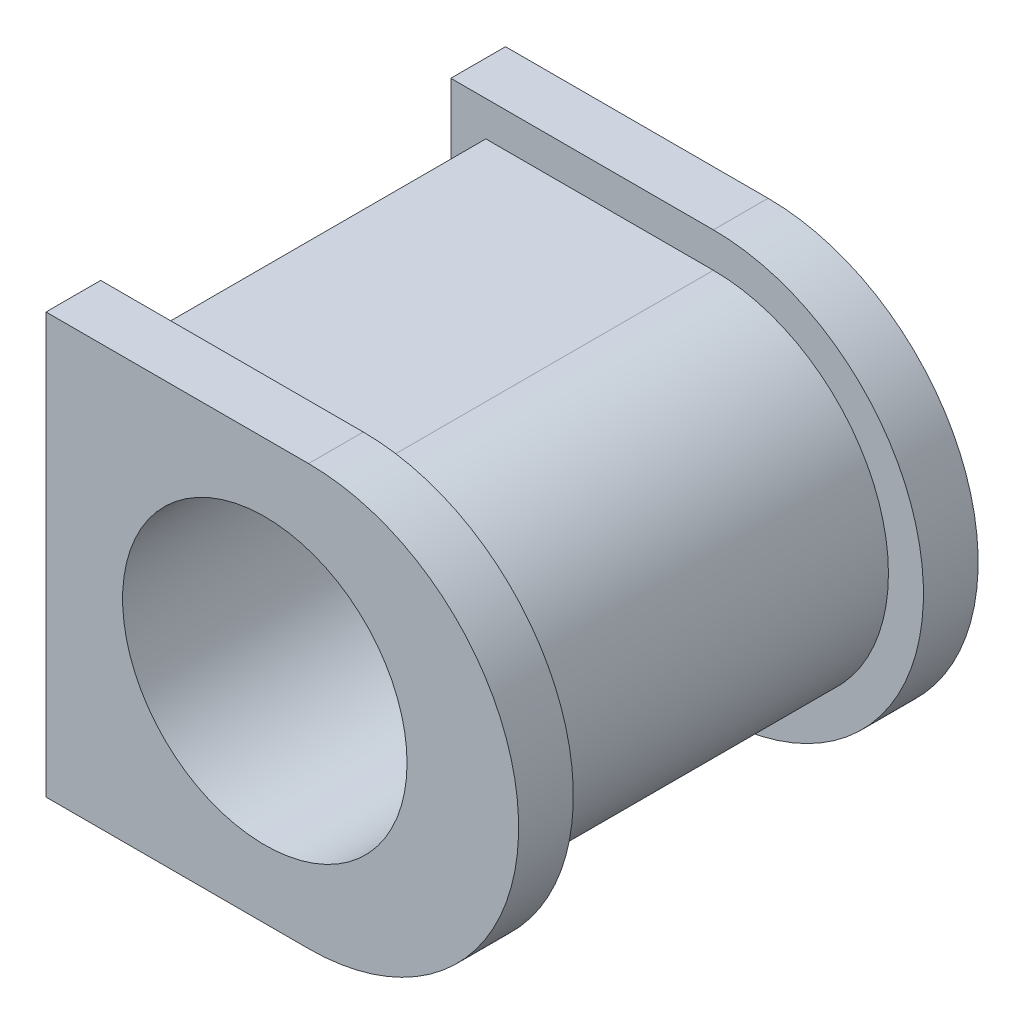
ISO-10303-21;
HEADER;
FILE_DESCRIPTION(('STEP AP214'),'2;1');
FILE_NAME('part.step','',(''),(''),'','','');
FILE_SCHEMA(('AUTOMOTIVE_DESIGN { 1 0 10303 214 1 1 1 1 }'));
ENDSEC;
DATA;
#1=APPLICATION_CONTEXT('core data for automotive mechanical design processes');
#2=APPLICATION_PROTOCOL_DEFINITION('international standard','automotive_design',2000,#1);
#3=PRODUCT_CONTEXT('',#1,'mechanical');
#4=PRODUCT('Part','Part','',(#3));
#5=PRODUCT_RELATED_PRODUCT_CATEGORY('part','',(#4));
#6=PRODUCT_DEFINITION_FORMATION('','',#4);
#7=PRODUCT_DEFINITION_CONTEXT('part definition',#1,'design');
#8=PRODUCT_DEFINITION('design','',#6,#7);
#9=PRODUCT_DEFINITION_SHAPE('','',#8);
#10=(LENGTH_UNIT() NAMED_UNIT(*) SI_UNIT(.MILLI.,.METRE.));
#11=(NAMED_UNIT(*) PLANE_ANGLE_UNIT() SI_UNIT($,.RADIAN.));
#12=(NAMED_UNIT(*) SI_UNIT($,.STERADIAN.) SOLID_ANGLE_UNIT());
#13=UNCERTAINTY_MEASURE_WITH_UNIT(LENGTH_MEASURE(1.E-05),#10,'distance_accuracy_value','');
#14=(GEOMETRIC_REPRESENTATION_CONTEXT(3) GLOBAL_UNCERTAINTY_ASSIGNED_CONTEXT((#13)) GLOBAL_UNIT_ASSIGNED_CONTEXT((#10,
#11,#12)) REPRESENTATION_CONTEXT('',''));
#15=CARTESIAN_POINT('',(0.,0.,0.));
#16=DIRECTION('',(0.,0.,1.));
#17=DIRECTION('',(1.,0.,0.));
#18=AXIS2_PLACEMENT_3D('',#15,#16,#17);
#19=CARTESIAN_POINT('',(0.,40.,80.));
#20=DIRECTION('',(0.,-1.,0.));
#21=DIRECTION('',(0.,0.,-1.));
#22=AXIS2_PLACEMENT_3D('',#19,#20,#21);
#23=PLANE('',#22);
#24=DIRECTION('',(-1.,0.,0.));
#25=VECTOR('',#24,1.);
#26=CARTESIAN_POINT('',(0.,40.,0.));
#27=LINE('',#26,#25);
#28=CARTESIAN_POINT('',(52.,40.,0.));
#29=VERTEX_POINT('',#28);
#30=CARTESIAN_POINT('',(0.,40.,0.));
#31=VERTEX_POINT('',#30);
#32=EDGE_CURVE('E142',#29,#31,#27,.T.);
#33=ORIENTED_EDGE('',*,*,#32,.T.);
#34=DIRECTION('',(0.,0.,-1.));
#35=VECTOR('',#34,1.);
#36=CARTESIAN_POINT('',(0.,40.,80.));
#37=LINE('',#36,#35);
#38=CARTESIAN_POINT('',(0.,40.,80.));
#39=VERTEX_POINT('',#38);
#40=EDGE_CURVE('E11',#39,#31,#37,.T.);
#41=ORIENTED_EDGE('',*,*,#40,.F.);
#42=DIRECTION('',(-1.,0.,0.));
#43=VECTOR('',#42,1.);
#44=CARTESIAN_POINT('',(0.,40.,80.));
#45=LINE('',#44,#43);
#46=CARTESIAN_POINT('',(52.,40.,80.));
#47=VERTEX_POINT('',#46);
#48=EDGE_CURVE('E209',#47,#39,#45,.T.);
#49=ORIENTED_EDGE('',*,*,#48,.F.);
#50=DIRECTION('',(0.,0.,-1.));
#51=VECTOR('',#50,1.);
#52=CARTESIAN_POINT('',(52.,40.,80.));
#53=LINE('',#52,#51);
#54=EDGE_CURVE('E221',#47,#29,#53,.T.);
#55=ORIENTED_EDGE('',*,*,#54,.T.);
#56=EDGE_LOOP('',(#33,#41,#49,#55));
#57=FACE_BOUND('',#56,.T.);
#58=ADVANCED_FACE('F37',(#57),#23,.F.);
#59=CARTESIAN_POINT('',(0.,-40.,80.));
#60=DIRECTION('',(1.,0.,0.));
#61=DIRECTION('',(0.,0.,-1.));
#62=AXIS2_PLACEMENT_3D('',#59,#60,#61);
#63=PLANE('',#62);
#64=DIRECTION('',(0.,-1.,0.));
#65=VECTOR('',#64,1.);
#66=CARTESIAN_POINT('',(0.,-40.,0.));
#67=LINE('',#66,#65);
#68=CARTESIAN_POINT('',(0.,-40.,0.));
#69=VERTEX_POINT('',#68);
#70=EDGE_CURVE('E171',#31,#69,#67,.T.);
#71=ORIENTED_EDGE('',*,*,#70,.T.);
#72=DIRECTION('',(0.,0.,-1.));
#73=VECTOR('',#72,1.);
#74=CARTESIAN_POINT('',(0.,-40.,80.));
#75=LINE('',#74,#73);
#76=CARTESIAN_POINT('',(0.,-40.,80.));
#77=VERTEX_POINT('',#76);
#78=EDGE_CURVE('E45',#77,#69,#75,.T.);
#79=ORIENTED_EDGE('',*,*,#78,.F.);
#80=DIRECTION('',(0.,-1.,0.));
#81=VECTOR('',#80,1.);
#82=CARTESIAN_POINT('',(0.,-40.,80.));
#83=LINE('',#82,#81);
#84=EDGE_CURVE('E212',#39,#77,#83,.T.);
#85=ORIENTED_EDGE('',*,*,#84,.F.);
#86=ORIENTED_EDGE('',*,*,#40,.T.);
#87=EDGE_LOOP('',(#71,#79,#85,#86));
#88=FACE_BOUND('',#87,.T.);
#89=ADVANCED_FACE('F227',(#88),#63,.F.);
#90=CARTESIAN_POINT('',(0.,-40.,80.));
#91=DIRECTION('',(0.,1.,0.));
#92=DIRECTION('',(0.,0.,1.));
#93=AXIS2_PLACEMENT_3D('',#90,#91,#92);
#94=PLANE('',#93);
#95=DIRECTION('',(1.,0.,0.));
#96=VECTOR('',#95,1.);
#97=CARTESIAN_POINT('',(0.,-40.,0.));
#98=LINE('',#97,#96);
#99=CARTESIAN_POINT('',(52.,-40.,0.));
#100=VERTEX_POINT('',#99);
#101=EDGE_CURVE('E174',#69,#100,#98,.T.);
#102=ORIENTED_EDGE('',*,*,#101,.T.);
#103=DIRECTION('',(0.,0.,-1.));
#104=VECTOR('',#103,1.);
#105=CARTESIAN_POINT('',(52.,-40.,80.));
#106=LINE('',#105,#104);
#107=CARTESIAN_POINT('',(52.,-40.,80.));
#108=VERTEX_POINT('',#107);
#109=EDGE_CURVE('E52',#108,#100,#106,.T.);
#110=ORIENTED_EDGE('',*,*,#109,.F.);
#111=DIRECTION('',(1.,0.,0.));
#112=VECTOR('',#111,1.);
#113=CARTESIAN_POINT('',(0.,-40.,80.));
#114=LINE('',#113,#112);
#115=EDGE_CURVE('E215',#77,#108,#114,.T.);
#116=ORIENTED_EDGE('',*,*,#115,.F.);
#117=ORIENTED_EDGE('',*,*,#78,.T.);
#118=EDGE_LOOP('',(#102,#110,#116,#117));
#119=FACE_BOUND('',#118,.T.);
#120=ADVANCED_FACE('F225',(#119),#94,.F.);
#121=CARTESIAN_POINT('',(52.,0.,80.));
#122=DIRECTION('',(0.,0.,-1.));
#123=DIRECTION('',(-1.,0.,0.));
#124=AXIS2_PLACEMENT_3D('',#121,#122,#123);
#125=CYLINDRICAL_SURFACE('',#124,40.);
#126=CARTESIAN_POINT('',(52.,0.,0.));
#127=DIRECTION('',(0.,0.,1.));
#128=DIRECTION('',(-1.,0.,0.));
#129=AXIS2_PLACEMENT_3D('',#126,#127,#128);
#130=CIRCLE('',#129,40.);
#131=EDGE_CURVE('E176',#100,#29,#130,.T.);
#132=ORIENTED_EDGE('',*,*,#131,.T.);
#133=ORIENTED_EDGE('',*,*,#54,.F.);
#134=CARTESIAN_POINT('',(52.,0.,80.));
#135=DIRECTION('',(0.,0.,1.));
#136=DIRECTION('',(-1.,0.,0.));
#137=AXIS2_PLACEMENT_3D('',#134,#135,#136);
#138=CIRCLE('',#137,40.);
#139=EDGE_CURVE('E218',#108,#47,#138,.T.);
#140=ORIENTED_EDGE('',*,*,#139,.F.);
#141=ORIENTED_EDGE('',*,*,#109,.T.);
#142=EDGE_LOOP('',(#132,#133,#140,#141));
#143=FACE_BOUND('',#142,.T.);
#144=ADVANCED_FACE('F235',(#143),#125,.T.);
#145=CARTESIAN_POINT('',(-8.,48.,92.5));
#146=DIRECTION('',(0.,-1.,0.));
#147=DIRECTION('',(0.,0.,-1.));
#148=AXIS2_PLACEMENT_3D('',#145,#146,#147);
#149=PLANE('',#148);
#150=DIRECTION('',(-1.,0.,0.));
#151=VECTOR('',#150,1.);
#152=CARTESIAN_POINT('',(-8.,48.,80.));
#153=LINE('',#152,#151);
#154=CARTESIAN_POINT('',(52.,48.,80.));
#155=VERTEX_POINT('',#154);
#156=CARTESIAN_POINT('',(-8.,48.,80.));
#157=VERTEX_POINT('',#156);
#158=EDGE_CURVE('E179',#155,#157,#153,.T.);
#159=ORIENTED_EDGE('',*,*,#158,.T.);
#160=DIRECTION('',(0.,0.,-1.));
#161=VECTOR('',#160,1.);
#162=CARTESIAN_POINT('',(-8.,48.,92.5));
#163=LINE('',#162,#161);
#164=CARTESIAN_POINT('',(-8.,48.,92.5));
#165=VERTEX_POINT('',#164);
#166=EDGE_CURVE('E206',#165,#157,#163,.T.);
#167=ORIENTED_EDGE('',*,*,#166,.F.);
#168=DIRECTION('',(-1.,0.,0.));
#169=VECTOR('',#168,1.);
#170=CARTESIAN_POINT('',(-8.,48.,92.5));
#171=LINE('',#170,#169);
#172=CARTESIAN_POINT('',(52.,48.,92.5));
#173=VERTEX_POINT('',#172);
#174=EDGE_CURVE('E180',#173,#165,#171,.T.);
#175=ORIENTED_EDGE('',*,*,#174,.F.);
#176=DIRECTION('',(0.,0.,-1.));
#177=VECTOR('',#176,1.);
#178=CARTESIAN_POINT('',(52.,48.,92.5));
#179=LINE('',#178,#177);
#180=EDGE_CURVE('E190',#173,#155,#179,.T.);
#181=ORIENTED_EDGE('',*,*,#180,.T.);
#182=EDGE_LOOP('',(#159,#167,#175,#181));
#183=FACE_BOUND('',#182,.T.);
#184=ADVANCED_FACE('F248',(#183),#149,.F.);
#185=CARTESIAN_POINT('',(-8.,48.,92.5));
#186=DIRECTION('',(1.,0.,0.));
#187=DIRECTION('',(0.,1.,0.));
#188=AXIS2_PLACEMENT_3D('',#185,#186,#187);
#189=PLANE('',#188);
#190=DIRECTION('',(0.,-1.,0.));
#191=VECTOR('',#190,1.);
#192=CARTESIAN_POINT('',(-8.,48.,80.));
#193=LINE('',#192,#191);
#194=CARTESIAN_POINT('',(-7.99999999999999,-48.,80.));
#195=VERTEX_POINT('',#194);
#196=EDGE_CURVE('E193',#157,#195,#193,.T.);
#197=ORIENTED_EDGE('',*,*,#196,.T.);
#198=DIRECTION('',(0.,0.,-1.));
#199=VECTOR('',#198,1.);
#200=CARTESIAN_POINT('',(-7.99999999999999,-48.,92.5));
#201=LINE('',#200,#199);
#202=CARTESIAN_POINT('',(-7.99999999999999,-48.,92.5));
#203=VERTEX_POINT('',#202);
#204=EDGE_CURVE('E203',#203,#195,#201,.T.);
#205=ORIENTED_EDGE('',*,*,#204,.F.);
#206=DIRECTION('',(0.,-1.,0.));
#207=VECTOR('',#206,1.);
#208=CARTESIAN_POINT('',(-8.,48.,92.5));
#209=LINE('',#208,#207);
#210=EDGE_CURVE('E183',#165,#203,#209,.T.);
#211=ORIENTED_EDGE('',*,*,#210,.F.);
#212=ORIENTED_EDGE('',*,*,#166,.T.);
#213=EDGE_LOOP('',(#197,#205,#211,#212));
#214=FACE_BOUND('',#213,.T.);
#215=ADVANCED_FACE('F260',(#214),#189,.F.);
#216=CARTESIAN_POINT('',(-7.99999999999999,-48.,92.5));
#217=DIRECTION('',(0.,1.,0.));
#218=DIRECTION('',(0.,0.,1.));
#219=AXIS2_PLACEMENT_3D('',#216,#217,#218);
#220=PLANE('',#219);
#221=DIRECTION('',(1.,0.,0.));
#222=VECTOR('',#221,1.);
#223=CARTESIAN_POINT('',(-7.99999999999999,-48.,80.));
#224=LINE('',#223,#222);
#225=CARTESIAN_POINT('',(52.,-48.,80.));
#226=VERTEX_POINT('',#225);
#227=EDGE_CURVE('E195',#195,#226,#224,.T.);
#228=ORIENTED_EDGE('',*,*,#227,.T.);
#229=DIRECTION('',(0.,0.,-1.));
#230=VECTOR('',#229,1.);
#231=CARTESIAN_POINT('',(52.,-48.,92.5));
#232=LINE('',#231,#230);
#233=CARTESIAN_POINT('',(52.,-48.,92.5));
#234=VERTEX_POINT('',#233);
#235=EDGE_CURVE('E200',#234,#226,#232,.T.);
#236=ORIENTED_EDGE('',*,*,#235,.F.);
#237=DIRECTION('',(1.,0.,0.));
#238=VECTOR('',#237,1.);
#239=CARTESIAN_POINT('',(-7.99999999999999,-48.,92.5));
#240=LINE('',#239,#238);
#241=EDGE_CURVE('E186',#203,#234,#240,.T.);
#242=ORIENTED_EDGE('',*,*,#241,.F.);
#243=ORIENTED_EDGE('',*,*,#204,.T.);
#244=EDGE_LOOP('',(#228,#236,#242,#243));
#245=FACE_BOUND('',#244,.T.);
#246=ADVANCED_FACE('F257',(#245),#220,.F.);
#247=CARTESIAN_POINT('',(52.,0.,92.5));
#248=DIRECTION('',(0.,0.,-1.));
#249=DIRECTION('',(-1.,0.,0.));
#250=AXIS2_PLACEMENT_3D('',#247,#248,#249);
#251=CYLINDRICAL_SURFACE('',#250,48.);
#252=CARTESIAN_POINT('',(52.,0.,80.));
#253=DIRECTION('',(0.,0.,1.));
#254=DIRECTION('',(-1.,0.,0.));
#255=AXIS2_PLACEMENT_3D('',#252,#253,#254);
#256=CIRCLE('',#255,48.);
#257=EDGE_CURVE('E184',#226,#155,#256,.T.);
#258=ORIENTED_EDGE('',*,*,#257,.T.);
#259=ORIENTED_EDGE('',*,*,#180,.F.);
#260=CARTESIAN_POINT('',(52.,0.,92.5));
#261=DIRECTION('',(0.,0.,1.));
#262=DIRECTION('',(-1.,0.,0.));
#263=AXIS2_PLACEMENT_3D('',#260,#261,#262);
#264=CIRCLE('',#263,48.);
#265=EDGE_CURVE('E188',#234,#173,#264,.T.);
#266=ORIENTED_EDGE('',*,*,#265,.F.);
#267=ORIENTED_EDGE('',*,*,#235,.T.);
#268=EDGE_LOOP('',(#258,#259,#266,#267));
#269=FACE_BOUND('',#268,.T.);
#270=ADVANCED_FACE('F253',(#269),#251,.T.);
#271=CARTESIAN_POINT('',(52.,0.,92.5));
#272=DIRECTION('',(0.,0.,-1.));
#273=DIRECTION('',(-1.,0.,0.));
#274=AXIS2_PLACEMENT_3D('',#271,#272,#273);
#275=PLANE('',#274);
#276=CARTESIAN_POINT('',(42.,0.,92.5));
#277=DIRECTION('',(0.,0.,1.));
#278=DIRECTION('',(1.,0.,0.));
#279=AXIS2_PLACEMENT_3D('',#276,#277,#278);
#280=CIRCLE('',#279,32.5);
#281=CARTESIAN_POINT('',(74.5,0.,92.5));
#282=VERTEX_POINT('',#281);
#283=EDGE_CURVE('E439',#282,#282,#280,.T.);
#284=ORIENTED_EDGE('',*,*,#283,.F.);
#285=EDGE_LOOP('',(#284));
#286=FACE_BOUND('',#285,.T.);
#287=ORIENTED_EDGE('',*,*,#174,.T.);
#288=ORIENTED_EDGE('',*,*,#210,.T.);
#289=ORIENTED_EDGE('',*,*,#241,.T.);
#290=ORIENTED_EDGE('',*,*,#265,.T.);
#291=EDGE_LOOP('',(#287,#288,#289,#290));
#292=FACE_BOUND('',#291,.T.);
#293=ADVANCED_FACE('F241',(#286,#292),#275,.F.);
#294=CARTESIAN_POINT('',(52.,0.,80.));
#295=DIRECTION('',(0.,0.,-1.));
#296=DIRECTION('',(-1.,0.,0.));
#297=AXIS2_PLACEMENT_3D('',#294,#295,#296);
#298=PLANE('',#297);
#299=ORIENTED_EDGE('',*,*,#139,.T.);
#300=ORIENTED_EDGE('',*,*,#48,.T.);
#301=ORIENTED_EDGE('',*,*,#84,.T.);
#302=ORIENTED_EDGE('',*,*,#115,.T.);
#303=EDGE_LOOP('',(#299,#300,#301,#302));
#304=FACE_BOUND('',#303,.T.);
#305=ORIENTED_EDGE('',*,*,#158,.F.);
#306=ORIENTED_EDGE('',*,*,#257,.F.);
#307=ORIENTED_EDGE('',*,*,#227,.F.);
#308=ORIENTED_EDGE('',*,*,#196,.F.);
#309=EDGE_LOOP('',(#305,#306,#307,#308));
#310=FACE_BOUND('',#309,.T.);
#311=ADVANCED_FACE('F238',(#304,#310),#298,.T.);
#312=CARTESIAN_POINT('',(-8.,48.,-12.5));
#313=DIRECTION('',(0.,-1.,0.));
#314=DIRECTION('',(0.,0.,1.));
#315=AXIS2_PLACEMENT_3D('',#312,#313,#314);
#316=PLANE('',#315);
#317=DIRECTION('',(-1.,0.,0.));
#318=VECTOR('',#317,1.);
#319=CARTESIAN_POINT('',(-8.,48.,0.));
#320=LINE('',#319,#318);
#321=CARTESIAN_POINT('',(52.,48.,0.));
#322=VERTEX_POINT('',#321);
#323=CARTESIAN_POINT('',(-8.,48.,0.));
#324=VERTEX_POINT('',#323);
#325=EDGE_CURVE('E159',#322,#324,#320,.T.);
#326=ORIENTED_EDGE('',*,*,#325,.F.);
#327=DIRECTION('',(0.,0.,1.));
#328=VECTOR('',#327,1.);
#329=CARTESIAN_POINT('',(52.,48.,-12.5));
#330=LINE('',#329,#328);
#331=CARTESIAN_POINT('',(52.,48.,-12.5));
#332=VERTEX_POINT('',#331);
#333=EDGE_CURVE('E147',#332,#322,#330,.T.);
#334=ORIENTED_EDGE('',*,*,#333,.F.);
#335=DIRECTION('',(-1.,0.,0.));
#336=VECTOR('',#335,1.);
#337=CARTESIAN_POINT('',(-8.,48.,-12.5));
#338=LINE('',#337,#336);
#339=CARTESIAN_POINT('',(-8.,48.,-12.5));
#340=VERTEX_POINT('',#339);
#341=EDGE_CURVE('E126',#332,#340,#338,.T.);
#342=ORIENTED_EDGE('',*,*,#341,.T.);
#343=DIRECTION('',(0.,0.,1.));
#344=VECTOR('',#343,1.);
#345=CARTESIAN_POINT('',(-8.,48.,-12.5));
#346=LINE('',#345,#344);
#347=EDGE_CURVE('E135',#340,#324,#346,.T.);
#348=ORIENTED_EDGE('',*,*,#347,.T.);
#349=EDGE_LOOP('',(#326,#334,#342,#348));
#350=FACE_BOUND('',#349,.T.);
#351=ADVANCED_FACE('F145',(#350),#316,.F.);
#352=CARTESIAN_POINT('',(-8.,48.,-12.5));
#353=DIRECTION('',(1.,0.,0.));
#354=DIRECTION('',(0.,1.,0.));
#355=AXIS2_PLACEMENT_3D('',#352,#353,#354);
#356=PLANE('',#355);
#357=DIRECTION('',(0.,-1.,0.));
#358=VECTOR('',#357,1.);
#359=CARTESIAN_POINT('',(-8.,48.,0.));
#360=LINE('',#359,#358);
#361=CARTESIAN_POINT('',(-7.99999999999999,-48.,0.));
#362=VERTEX_POINT('',#361);
#363=EDGE_CURVE('E138',#324,#362,#360,.T.);
#364=ORIENTED_EDGE('',*,*,#363,.F.);
#365=ORIENTED_EDGE('',*,*,#347,.F.);
#366=DIRECTION('',(0.,-1.,0.));
#367=VECTOR('',#366,1.);
#368=CARTESIAN_POINT('',(-8.,48.,-12.5));
#369=LINE('',#368,#367);
#370=CARTESIAN_POINT('',(-7.99999999999999,-48.,-12.5));
#371=VERTEX_POINT('',#370);
#372=EDGE_CURVE('E122',#340,#371,#369,.T.);
#373=ORIENTED_EDGE('',*,*,#372,.T.);
#374=DIRECTION('',(0.,0.,1.));
#375=VECTOR('',#374,1.);
#376=CARTESIAN_POINT('',(-7.99999999999999,-48.,-12.5));
#377=LINE('',#376,#375);
#378=EDGE_CURVE('E143',#371,#362,#377,.T.);
#379=ORIENTED_EDGE('',*,*,#378,.T.);
#380=EDGE_LOOP('',(#364,#365,#373,#379));
#381=FACE_BOUND('',#380,.T.);
#382=ADVANCED_FACE('F136',(#381),#356,.F.);
#383=CARTESIAN_POINT('',(-7.99999999999999,-48.,-12.5));
#384=DIRECTION('',(0.,1.,0.));
#385=DIRECTION('',(0.,0.,-1.));
#386=AXIS2_PLACEMENT_3D('',#383,#384,#385);
#387=PLANE('',#386);
#388=DIRECTION('',(1.,0.,0.));
#389=VECTOR('',#388,1.);
#390=CARTESIAN_POINT('',(-7.99999999999999,-48.,0.));
#391=LINE('',#390,#389);
#392=CARTESIAN_POINT('',(52.,-48.,0.));
#393=VERTEX_POINT('',#392);
#394=EDGE_CURVE('E150',#362,#393,#391,.T.);
#395=ORIENTED_EDGE('',*,*,#394,.F.);
#396=ORIENTED_EDGE('',*,*,#378,.F.);
#397=DIRECTION('',(1.,0.,0.));
#398=VECTOR('',#397,1.);
#399=CARTESIAN_POINT('',(-7.99999999999999,-48.,-12.5));
#400=LINE('',#399,#398);
#401=CARTESIAN_POINT('',(52.,-48.,-12.5));
#402=VERTEX_POINT('',#401);
#403=EDGE_CURVE('E129',#371,#402,#400,.T.);
#404=ORIENTED_EDGE('',*,*,#403,.T.);
#405=DIRECTION('',(0.,0.,1.));
#406=VECTOR('',#405,1.);
#407=CARTESIAN_POINT('',(52.,-48.,-12.5));
#408=LINE('',#407,#406);
#409=EDGE_CURVE('E165',#402,#393,#408,.T.);
#410=ORIENTED_EDGE('',*,*,#409,.T.);
#411=EDGE_LOOP('',(#395,#396,#404,#410));
#412=FACE_BOUND('',#411,.T.);
#413=ADVANCED_FACE('F359',(#412),#387,.F.);
#414=CARTESIAN_POINT('',(52.,0.,-12.5));
#415=DIRECTION('',(0.,0.,1.));
#416=DIRECTION('',(-1.,0.,0.));
#417=AXIS2_PLACEMENT_3D('',#414,#415,#416);
#418=CYLINDRICAL_SURFACE('',#417,48.);
#419=CARTESIAN_POINT('',(52.,0.,0.));
#420=DIRECTION('',(0.,0.,1.));
#421=DIRECTION('',(-1.,0.,0.));
#422=AXIS2_PLACEMENT_3D('',#419,#420,#421);
#423=CIRCLE('',#422,48.);
#424=EDGE_CURVE('E148',#393,#322,#423,.T.);
#425=ORIENTED_EDGE('',*,*,#424,.F.);
#426=ORIENTED_EDGE('',*,*,#409,.F.);
#427=CARTESIAN_POINT('',(52.,0.,-12.5));
#428=DIRECTION('',(0.,0.,1.));
#429=DIRECTION('',(-1.,0.,0.));
#430=AXIS2_PLACEMENT_3D('',#427,#428,#429);
#431=CIRCLE('',#430,48.);
#432=EDGE_CURVE('E157',#402,#332,#431,.T.);
#433=ORIENTED_EDGE('',*,*,#432,.T.);
#434=ORIENTED_EDGE('',*,*,#333,.T.);
#435=EDGE_LOOP('',(#425,#426,#433,#434));
#436=FACE_BOUND('',#435,.T.);
#437=ADVANCED_FACE('F368',(#436),#418,.T.);
#438=CARTESIAN_POINT('',(52.,0.,-12.5));
#439=DIRECTION('',(0.,0.,1.));
#440=DIRECTION('',(-1.,0.,0.));
#441=AXIS2_PLACEMENT_3D('',#438,#439,#440);
#442=PLANE('',#441);
#443=CARTESIAN_POINT('',(42.,0.,-12.5));
#444=DIRECTION('',(0.,0.,1.));
#445=DIRECTION('',(1.,0.,0.));
#446=AXIS2_PLACEMENT_3D('',#443,#444,#445);
#447=CIRCLE('',#446,32.5);
#448=CARTESIAN_POINT('',(74.5,0.,-12.5));
#449=VERTEX_POINT('',#448);
#450=EDGE_CURVE('E153',#449,#449,#447,.T.);
#451=ORIENTED_EDGE('',*,*,#450,.T.);
#452=EDGE_LOOP('',(#451));
#453=FACE_BOUND('',#452,.T.);
#454=ORIENTED_EDGE('',*,*,#341,.F.);
#455=ORIENTED_EDGE('',*,*,#432,.F.);
#456=ORIENTED_EDGE('',*,*,#403,.F.);
#457=ORIENTED_EDGE('',*,*,#372,.F.);
#458=EDGE_LOOP('',(#454,#455,#456,#457));
#459=FACE_BOUND('',#458,.T.);
#460=ADVANCED_FACE('F124',(#453,#459),#442,.F.);
#461=CARTESIAN_POINT('',(52.,0.,0.));
#462=DIRECTION('',(0.,0.,1.));
#463=DIRECTION('',(-1.,0.,0.));
#464=AXIS2_PLACEMENT_3D('',#461,#462,#463);
#465=PLANE('',#464);
#466=ORIENTED_EDGE('',*,*,#131,.F.);
#467=ORIENTED_EDGE('',*,*,#101,.F.);
#468=ORIENTED_EDGE('',*,*,#70,.F.);
#469=ORIENTED_EDGE('',*,*,#32,.F.);
#470=EDGE_LOOP('',(#466,#467,#468,#469));
#471=FACE_BOUND('',#470,.T.);
#472=ORIENTED_EDGE('',*,*,#325,.T.);
#473=ORIENTED_EDGE('',*,*,#363,.T.);
#474=ORIENTED_EDGE('',*,*,#394,.T.);
#475=ORIENTED_EDGE('',*,*,#424,.T.);
#476=EDGE_LOOP('',(#472,#473,#474,#475));
#477=FACE_BOUND('',#476,.T.);
#478=ADVANCED_FACE('F231',(#471,#477),#465,.T.);
#479=CARTESIAN_POINT('',(42.,0.,92.5));
#480=DIRECTION('',(0.,0.,1.));
#481=DIRECTION('',(1.,0.,0.));
#482=AXIS2_PLACEMENT_3D('',#479,#480,#481);
#483=CYLINDRICAL_SURFACE('',#482,32.5);
#484=ORIENTED_EDGE('',*,*,#450,.F.);
#485=EDGE_LOOP('',(#484));
#486=FACE_BOUND('',#485,.T.);
#487=ORIENTED_EDGE('',*,*,#283,.T.);
#488=EDGE_LOOP('',(#487));
#489=FACE_BOUND('',#488,.T.);
#490=ADVANCED_FACE('F395',(#486,#489),#483,.F.);
#491=CLOSED_SHELL('',(#58,#89,#120,#144,#184,#215,#246,#270,#293,#311,#351,#382,#413,#437,#460,
#478,#490));
#492=MANIFOLD_SOLID_BREP('B2',#491);
#493=ADVANCED_BREP_SHAPE_REPRESENTATION('',(#18,#492),#14);
#494=SHAPE_DEFINITION_REPRESENTATION(#9,#493);
ENDSEC;
END-ISO-10303-21;
